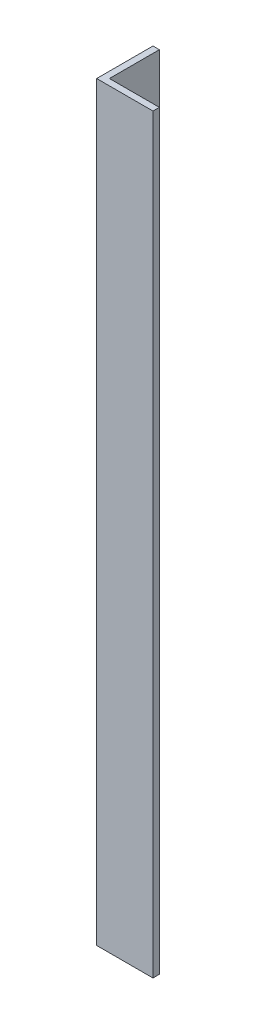
ISO-10303-21;
HEADER;
FILE_DESCRIPTION(('STEP AP214'),'2;1');
FILE_NAME('part.step','',(''),(''),'','','');
FILE_SCHEMA(('AUTOMOTIVE_DESIGN { 1 0 10303 214 1 1 1 1 }'));
ENDSEC;
DATA;
#1=APPLICATION_CONTEXT('core data for automotive mechanical design processes');
#2=APPLICATION_PROTOCOL_DEFINITION('international standard','automotive_design',2000,#1);
#3=PRODUCT_CONTEXT('',#1,'mechanical');
#4=PRODUCT('Part','Part','',(#3));
#5=PRODUCT_RELATED_PRODUCT_CATEGORY('part','',(#4));
#6=PRODUCT_DEFINITION_FORMATION('','',#4);
#7=PRODUCT_DEFINITION_CONTEXT('part definition',#1,'design');
#8=PRODUCT_DEFINITION('design','',#6,#7);
#9=PRODUCT_DEFINITION_SHAPE('','',#8);
#10=(LENGTH_UNIT() NAMED_UNIT(*) SI_UNIT(.MILLI.,.METRE.));
#11=(NAMED_UNIT(*) PLANE_ANGLE_UNIT() SI_UNIT($,.RADIAN.));
#12=(NAMED_UNIT(*) SI_UNIT($,.STERADIAN.) SOLID_ANGLE_UNIT());
#13=UNCERTAINTY_MEASURE_WITH_UNIT(LENGTH_MEASURE(1.E-05),#10,'distance_accuracy_value','');
#14=(GEOMETRIC_REPRESENTATION_CONTEXT(3) GLOBAL_UNCERTAINTY_ASSIGNED_CONTEXT((#13)) GLOBAL_UNIT_ASSIGNED_CONTEXT((#10,
#11,#12)) REPRESENTATION_CONTEXT('',''));
#15=CARTESIAN_POINT('',(0.,0.,0.));
#16=DIRECTION('',(0.,0.,1.));
#17=DIRECTION('',(1.,0.,0.));
#18=AXIS2_PLACEMENT_3D('',#15,#16,#17);
#19=CARTESIAN_POINT('',(0.,400.,0.));
#20=DIRECTION('',(0.,0.,-1.));
#21=DIRECTION('',(-1.,0.,0.));
#22=AXIS2_PLACEMENT_3D('',#19,#20,#21);
#23=PLANE('',#22);
#24=DIRECTION('',(1.,0.,0.));
#25=VECTOR('',#24,1.);
#26=CARTESIAN_POINT('',(0.,0.,0.));
#27=LINE('',#26,#25);
#28=CARTESIAN_POINT('',(0.,0.,0.));
#29=VERTEX_POINT('',#28);
#30=CARTESIAN_POINT('',(30.,0.,0.));
#31=VERTEX_POINT('',#30);
#32=EDGE_CURVE('E133',#29,#31,#27,.T.);
#33=ORIENTED_EDGE('',*,*,#32,.T.);
#34=DIRECTION('',(0.,-1.,0.));
#35=VECTOR('',#34,1.);
#36=CARTESIAN_POINT('',(30.,400.,0.));
#37=LINE('',#36,#35);
#38=CARTESIAN_POINT('',(30.,400.,0.));
#39=VERTEX_POINT('',#38);
#40=EDGE_CURVE('E11',#39,#31,#37,.T.);
#41=ORIENTED_EDGE('',*,*,#40,.F.);
#42=DIRECTION('',(1.,0.,0.));
#43=VECTOR('',#42,1.);
#44=CARTESIAN_POINT('',(0.,400.,0.));
#45=LINE('',#44,#43);
#46=CARTESIAN_POINT('',(0.,400.,0.));
#47=VERTEX_POINT('',#46);
#48=EDGE_CURVE('E149',#47,#39,#45,.T.);
#49=ORIENTED_EDGE('',*,*,#48,.F.);
#50=DIRECTION('',(0.,-1.,0.));
#51=VECTOR('',#50,1.);
#52=CARTESIAN_POINT('',(0.,400.,0.));
#53=LINE('',#52,#51);
#54=EDGE_CURVE('E129',#47,#29,#53,.T.);
#55=ORIENTED_EDGE('',*,*,#54,.T.);
#56=EDGE_LOOP('',(#33,#41,#49,#55));
#57=FACE_BOUND('',#56,.T.);
#58=ADVANCED_FACE('F44',(#57),#23,.F.);
#59=CARTESIAN_POINT('',(30.,400.,0.));
#60=DIRECTION('',(-1.,0.,0.));
#61=DIRECTION('',(0.,0.,1.));
#62=AXIS2_PLACEMENT_3D('',#59,#60,#61);
#63=PLANE('',#62);
#64=DIRECTION('',(0.,0.,-1.));
#65=VECTOR('',#64,1.);
#66=CARTESIAN_POINT('',(30.,0.,0.));
#67=LINE('',#66,#65);
#68=CARTESIAN_POINT('',(30.,0.,-3.4));
#69=VERTEX_POINT('',#68);
#70=EDGE_CURVE('E137',#31,#69,#67,.T.);
#71=ORIENTED_EDGE('',*,*,#70,.T.);
#72=DIRECTION('',(0.,-1.,0.));
#73=VECTOR('',#72,1.);
#74=CARTESIAN_POINT('',(30.,400.,-3.4));
#75=LINE('',#74,#73);
#76=CARTESIAN_POINT('',(30.,400.,-3.4));
#77=VERTEX_POINT('',#76);
#78=EDGE_CURVE('E53',#77,#69,#75,.T.);
#79=ORIENTED_EDGE('',*,*,#78,.F.);
#80=DIRECTION('',(0.,0.,-1.));
#81=VECTOR('',#80,1.);
#82=CARTESIAN_POINT('',(30.,400.,0.));
#83=LINE('',#82,#81);
#84=EDGE_CURVE('E98',#39,#77,#83,.T.);
#85=ORIENTED_EDGE('',*,*,#84,.F.);
#86=ORIENTED_EDGE('',*,*,#40,.T.);
#87=EDGE_LOOP('',(#71,#79,#85,#86));
#88=FACE_BOUND('',#87,.T.);
#89=ADVANCED_FACE('F177',(#88),#63,.F.);
#90=CARTESIAN_POINT('',(3.4,400.,-3.4));
#91=DIRECTION('',(0.,0.,1.));
#92=DIRECTION('',(1.,0.,0.));
#93=AXIS2_PLACEMENT_3D('',#90,#91,#92);
#94=PLANE('',#93);
#95=DIRECTION('',(-1.,0.,0.));
#96=VECTOR('',#95,1.);
#97=CARTESIAN_POINT('',(3.4,0.,-3.4));
#98=LINE('',#97,#96);
#99=CARTESIAN_POINT('',(3.4,0.,-3.4));
#100=VERTEX_POINT('',#99);
#101=EDGE_CURVE('E140',#69,#100,#98,.T.);
#102=ORIENTED_EDGE('',*,*,#101,.T.);
#103=DIRECTION('',(0.,-1.,0.));
#104=VECTOR('',#103,1.);
#105=CARTESIAN_POINT('',(3.4,400.,-3.4));
#106=LINE('',#105,#104);
#107=CARTESIAN_POINT('',(3.4,400.,-3.4));
#108=VERTEX_POINT('',#107);
#109=EDGE_CURVE('E122',#108,#100,#106,.T.);
#110=ORIENTED_EDGE('',*,*,#109,.F.);
#111=DIRECTION('',(-1.,0.,0.));
#112=VECTOR('',#111,1.);
#113=CARTESIAN_POINT('',(3.4,400.,-3.4));
#114=LINE('',#113,#112);
#115=EDGE_CURVE('E111',#77,#108,#114,.T.);
#116=ORIENTED_EDGE('',*,*,#115,.F.);
#117=ORIENTED_EDGE('',*,*,#78,.T.);
#118=EDGE_LOOP('',(#102,#110,#116,#117));
#119=FACE_BOUND('',#118,.T.);
#120=ADVANCED_FACE('F159',(#119),#94,.F.);
#121=CARTESIAN_POINT('',(3.4,400.,-30.));
#122=DIRECTION('',(-1.,0.,0.));
#123=DIRECTION('',(0.,0.,1.));
#124=AXIS2_PLACEMENT_3D('',#121,#122,#123);
#125=PLANE('',#124);
#126=DIRECTION('',(0.,0.,-1.));
#127=VECTOR('',#126,1.);
#128=CARTESIAN_POINT('',(3.4,0.,-30.));
#129=LINE('',#128,#127);
#130=CARTESIAN_POINT('',(3.4,0.,-30.));
#131=VERTEX_POINT('',#130);
#132=EDGE_CURVE('E120',#100,#131,#129,.T.);
#133=ORIENTED_EDGE('',*,*,#132,.T.);
#134=DIRECTION('',(0.,-1.,0.));
#135=VECTOR('',#134,1.);
#136=CARTESIAN_POINT('',(3.4,400.,-30.));
#137=LINE('',#136,#135);
#138=CARTESIAN_POINT('',(3.4,400.,-30.));
#139=VERTEX_POINT('',#138);
#140=EDGE_CURVE('E117',#139,#131,#137,.T.);
#141=ORIENTED_EDGE('',*,*,#140,.F.);
#142=DIRECTION('',(0.,0.,-1.));
#143=VECTOR('',#142,1.);
#144=CARTESIAN_POINT('',(3.4,400.,-30.));
#145=LINE('',#144,#143);
#146=EDGE_CURVE('E105',#108,#139,#145,.T.);
#147=ORIENTED_EDGE('',*,*,#146,.F.);
#148=ORIENTED_EDGE('',*,*,#109,.T.);
#149=EDGE_LOOP('',(#133,#141,#147,#148));
#150=FACE_BOUND('',#149,.T.);
#151=ADVANCED_FACE('F118',(#150),#125,.F.);
#152=CARTESIAN_POINT('',(0.,400.,-30.));
#153=DIRECTION('',(0.,0.,1.));
#154=DIRECTION('',(1.,0.,0.));
#155=AXIS2_PLACEMENT_3D('',#152,#153,#154);
#156=PLANE('',#155);
#157=DIRECTION('',(-1.,0.,0.));
#158=VECTOR('',#157,1.);
#159=CARTESIAN_POINT('',(0.,0.,-30.));
#160=LINE('',#159,#158);
#161=CARTESIAN_POINT('',(0.,0.,-30.));
#162=VERTEX_POINT('',#161);
#163=EDGE_CURVE('E84',#131,#162,#160,.T.);
#164=ORIENTED_EDGE('',*,*,#163,.T.);
#165=DIRECTION('',(0.,-1.,0.));
#166=VECTOR('',#165,1.);
#167=CARTESIAN_POINT('',(0.,400.,-30.));
#168=LINE('',#167,#166);
#169=CARTESIAN_POINT('',(0.,400.,-30.));
#170=VERTEX_POINT('',#169);
#171=EDGE_CURVE('E123',#170,#162,#168,.T.);
#172=ORIENTED_EDGE('',*,*,#171,.F.);
#173=DIRECTION('',(-1.,0.,0.));
#174=VECTOR('',#173,1.);
#175=CARTESIAN_POINT('',(0.,400.,-30.));
#176=LINE('',#175,#174);
#177=EDGE_CURVE('E109',#139,#170,#176,.T.);
#178=ORIENTED_EDGE('',*,*,#177,.F.);
#179=ORIENTED_EDGE('',*,*,#140,.T.);
#180=EDGE_LOOP('',(#164,#172,#178,#179));
#181=FACE_BOUND('',#180,.T.);
#182=ADVANCED_FACE('F125',(#181),#156,.F.);
#183=CARTESIAN_POINT('',(0.,400.,0.));
#184=DIRECTION('',(1.,0.,0.));
#185=DIRECTION('',(0.,0.,-1.));
#186=AXIS2_PLACEMENT_3D('',#183,#184,#185);
#187=PLANE('',#186);
#188=DIRECTION('',(0.,0.,1.));
#189=VECTOR('',#188,1.);
#190=CARTESIAN_POINT('',(0.,0.,0.));
#191=LINE('',#190,#189);
#192=EDGE_CURVE('E90',#162,#29,#191,.T.);
#193=ORIENTED_EDGE('',*,*,#192,.T.);
#194=ORIENTED_EDGE('',*,*,#54,.F.);
#195=DIRECTION('',(0.,0.,1.));
#196=VECTOR('',#195,1.);
#197=CARTESIAN_POINT('',(0.,400.,0.));
#198=LINE('',#197,#196);
#199=EDGE_CURVE('E61',#170,#47,#198,.T.);
#200=ORIENTED_EDGE('',*,*,#199,.F.);
#201=ORIENTED_EDGE('',*,*,#171,.T.);
#202=EDGE_LOOP('',(#193,#194,#200,#201));
#203=FACE_BOUND('',#202,.T.);
#204=ADVANCED_FACE('F166',(#203),#187,.F.);
#205=CARTESIAN_POINT('',(0.,400.,0.));
#206=DIRECTION('',(0.,1.,0.));
#207=DIRECTION('',(0.,0.,1.));
#208=AXIS2_PLACEMENT_3D('',#205,#206,#207);
#209=PLANE('',#208);
#210=ORIENTED_EDGE('',*,*,#48,.T.);
#211=ORIENTED_EDGE('',*,*,#84,.T.);
#212=ORIENTED_EDGE('',*,*,#115,.T.);
#213=ORIENTED_EDGE('',*,*,#146,.T.);
#214=ORIENTED_EDGE('',*,*,#177,.T.);
#215=ORIENTED_EDGE('',*,*,#199,.T.);
#216=EDGE_LOOP('',(#210,#211,#212,#213,#214,#215));
#217=FACE_BOUND('',#216,.T.);
#218=ADVANCED_FACE('F107',(#217),#209,.T.);
#219=CARTESIAN_POINT('',(0.,0.,0.));
#220=DIRECTION('',(0.,1.,0.));
#221=DIRECTION('',(0.,0.,1.));
#222=AXIS2_PLACEMENT_3D('',#219,#220,#221);
#223=PLANE('',#222);
#224=ORIENTED_EDGE('',*,*,#32,.F.);
#225=ORIENTED_EDGE('',*,*,#192,.F.);
#226=ORIENTED_EDGE('',*,*,#163,.F.);
#227=ORIENTED_EDGE('',*,*,#132,.F.);
#228=ORIENTED_EDGE('',*,*,#101,.F.);
#229=ORIENTED_EDGE('',*,*,#70,.F.);
#230=EDGE_LOOP('',(#224,#225,#226,#227,#228,#229));
#231=FACE_BOUND('',#230,.T.);
#232=ADVANCED_FACE('F162',(#231),#223,.F.);
#233=CLOSED_SHELL('',(#58,#89,#120,#151,#182,#204,#218,#232));
#234=MANIFOLD_SOLID_BREP('B2',#233);
#235=ADVANCED_BREP_SHAPE_REPRESENTATION('',(#18,#234),#14);
#236=SHAPE_DEFINITION_REPRESENTATION(#9,#235);
ENDSEC;
END-ISO-10303-21;
